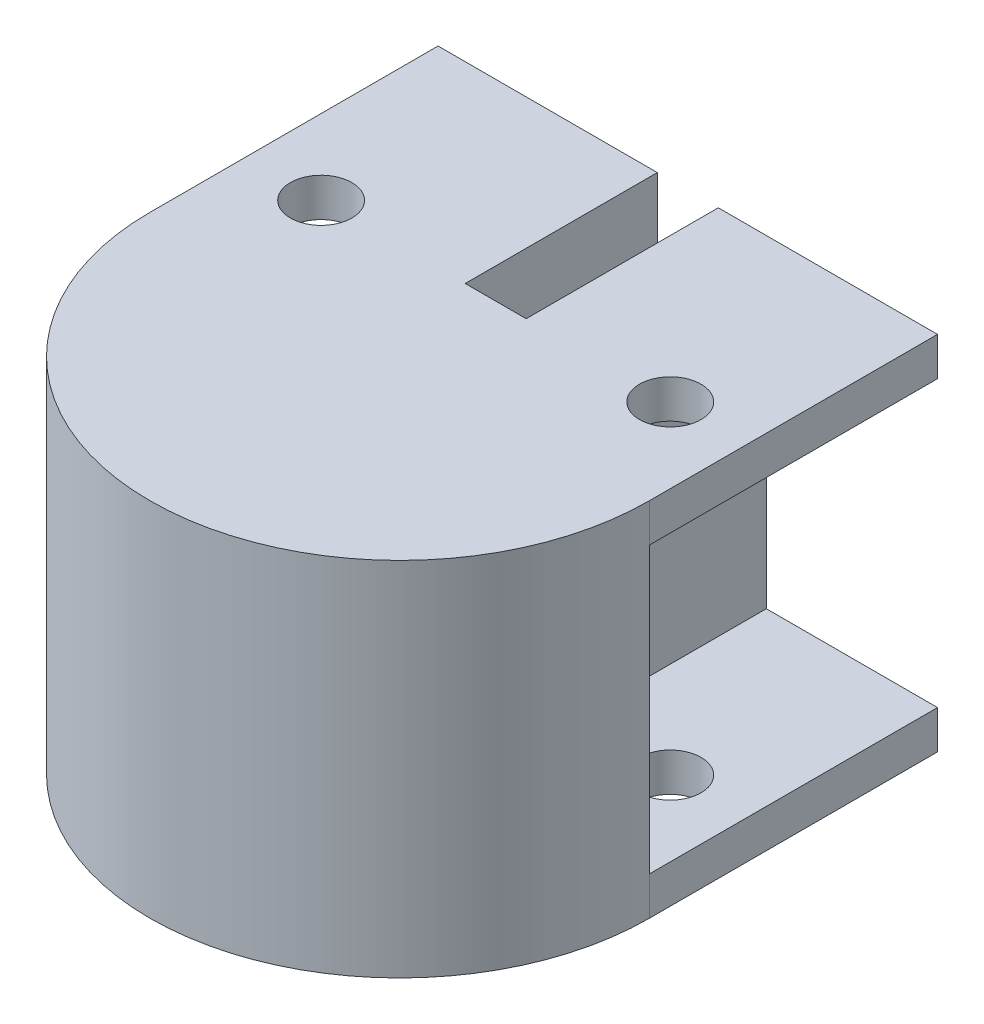
ISO-10303-21;
HEADER;
FILE_DESCRIPTION(('STEP AP214'),'2;1');
FILE_NAME('part.step','',(''),(''),'','','');
FILE_SCHEMA(('AUTOMOTIVE_DESIGN { 1 0 10303 214 1 1 1 1 }'));
ENDSEC;
DATA;
#1=APPLICATION_CONTEXT('core data for automotive mechanical design processes');
#2=APPLICATION_PROTOCOL_DEFINITION('international standard','automotive_design',2000,#1);
#3=PRODUCT_CONTEXT('',#1,'mechanical');
#4=PRODUCT('Part','Part','',(#3));
#5=PRODUCT_RELATED_PRODUCT_CATEGORY('part','',(#4));
#6=PRODUCT_DEFINITION_FORMATION('','',#4);
#7=PRODUCT_DEFINITION_CONTEXT('part definition',#1,'design');
#8=PRODUCT_DEFINITION('design','',#6,#7);
#9=PRODUCT_DEFINITION_SHAPE('','',#8);
#10=(LENGTH_UNIT() NAMED_UNIT(*) SI_UNIT(.MILLI.,.METRE.));
#11=(NAMED_UNIT(*) PLANE_ANGLE_UNIT() SI_UNIT($,.RADIAN.));
#12=(NAMED_UNIT(*) SI_UNIT($,.STERADIAN.) SOLID_ANGLE_UNIT());
#13=UNCERTAINTY_MEASURE_WITH_UNIT(LENGTH_MEASURE(1.E-05),#10,'distance_accuracy_value','');
#14=(GEOMETRIC_REPRESENTATION_CONTEXT(3) GLOBAL_UNCERTAINTY_ASSIGNED_CONTEXT((#13)) GLOBAL_UNIT_ASSIGNED_CONTEXT((#10,
#11,#12)) REPRESENTATION_CONTEXT('',''));
#15=CARTESIAN_POINT('',(0.,0.,0.));
#16=DIRECTION('',(0.,0.,1.));
#17=DIRECTION('',(1.,0.,0.));
#18=AXIS2_PLACEMENT_3D('',#15,#16,#17);
#19=CARTESIAN_POINT('',(0.,0.,5.));
#20=DIRECTION('',(0.,1.,0.));
#21=DIRECTION('',(0.,0.,1.));
#22=AXIS2_PLACEMENT_3D('',#19,#20,#21);
#23=PLANE('',#22);
#24=CARTESIAN_POINT('',(-9.0875,0.,0.));
#25=DIRECTION('',(0.,1.,0.));
#26=DIRECTION('',(0.,0.,-1.));
#27=AXIS2_PLACEMENT_3D('',#24,#25,#26);
#28=CIRCLE('',#27,1.6);
#29=CARTESIAN_POINT('',(-9.0875,0.,-1.6));
#30=VERTEX_POINT('',#29);
#31=EDGE_CURVE('E249',#30,#30,#28,.T.);
#32=ORIENTED_EDGE('',*,*,#31,.T.);
#33=EDGE_LOOP('',(#32));
#34=FACE_BOUND('',#33,.T.);
#35=DIRECTION('',(0.,0.,-1.));
#36=VECTOR('',#35,1.);
#37=CARTESIAN_POINT('',(-4.0875,0.,-10.));
#38=LINE('',#37,#36);
#39=CARTESIAN_POINT('',(-4.0875,0.,5.));
#40=VERTEX_POINT('',#39);
#41=CARTESIAN_POINT('',(-4.0875,0.,-10.));
#42=VERTEX_POINT('',#41);
#43=EDGE_CURVE('E48',#40,#42,#38,.T.);
#44=ORIENTED_EDGE('',*,*,#43,.F.);
#45=DIRECTION('',(1.,0.,0.));
#46=VECTOR('',#45,1.);
#47=CARTESIAN_POINT('',(-4.0875,0.,5.));
#48=LINE('',#47,#46);
#49=CARTESIAN_POINT('',(-13.,0.,5.));
#50=VERTEX_POINT('',#49);
#51=EDGE_CURVE('E229',#50,#40,#48,.T.);
#52=ORIENTED_EDGE('',*,*,#51,.F.);
#53=DIRECTION('',(0.,0.,1.));
#54=VECTOR('',#53,1.);
#55=CARTESIAN_POINT('',(-13.,0.,-10.));
#56=LINE('',#55,#54);
#57=CARTESIAN_POINT('',(-13.,0.,-10.));
#58=VERTEX_POINT('',#57);
#59=EDGE_CURVE('E278',#58,#50,#56,.T.);
#60=ORIENTED_EDGE('',*,*,#59,.F.);
#61=DIRECTION('',(-1.,0.,0.));
#62=VECTOR('',#61,1.);
#63=CARTESIAN_POINT('',(-1.5875,0.,-10.));
#64=LINE('',#63,#62);
#65=EDGE_CURVE('E259',#42,#58,#64,.T.);
#66=ORIENTED_EDGE('',*,*,#65,.F.);
#67=EDGE_LOOP('',(#44,#52,#60,#66));
#68=FACE_BOUND('',#67,.T.);
#69=ADVANCED_FACE('F33',(#34,#68),#23,.F.);
#70=CARTESIAN_POINT('',(9.0875,0.,0.));
#71=DIRECTION('',(0.,1.,0.));
#72=DIRECTION('',(0.,0.,1.));
#73=AXIS2_PLACEMENT_3D('',#70,#71,#72);
#74=CIRCLE('',#73,1.6);
#75=CARTESIAN_POINT('',(9.0875,0.,1.6));
#76=VERTEX_POINT('',#75);
#77=EDGE_CURVE('E253',#76,#76,#74,.T.);
#78=ORIENTED_EDGE('',*,*,#77,.T.);
#79=EDGE_LOOP('',(#78));
#80=FACE_BOUND('',#79,.T.);
#81=DIRECTION('',(0.,0.,1.));
#82=VECTOR('',#81,1.);
#83=CARTESIAN_POINT('',(4.0875,0.,-10.));
#84=LINE('',#83,#82);
#85=CARTESIAN_POINT('',(4.0875,0.,-10.));
#86=VERTEX_POINT('',#85);
#87=CARTESIAN_POINT('',(4.0875,0.,5.));
#88=VERTEX_POINT('',#87);
#89=EDGE_CURVE('E225',#86,#88,#84,.T.);
#90=ORIENTED_EDGE('',*,*,#89,.F.);
#91=DIRECTION('',(-1.,0.,0.));
#92=VECTOR('',#91,1.);
#93=CARTESIAN_POINT('',(1.5875,0.,-10.));
#94=LINE('',#93,#92);
#95=CARTESIAN_POINT('',(13.,0.,-10.));
#96=VERTEX_POINT('',#95);
#97=EDGE_CURVE('E264',#96,#86,#94,.T.);
#98=ORIENTED_EDGE('',*,*,#97,.F.);
#99=DIRECTION('',(0.,0.,-1.));
#100=VECTOR('',#99,1.);
#101=CARTESIAN_POINT('',(13.,0.,-10.));
#102=LINE('',#101,#100);
#103=CARTESIAN_POINT('',(13.,0.,5.));
#104=VERTEX_POINT('',#103);
#105=EDGE_CURVE('E281',#104,#96,#102,.T.);
#106=ORIENTED_EDGE('',*,*,#105,.F.);
#107=DIRECTION('',(1.,0.,0.));
#108=VECTOR('',#107,1.);
#109=CARTESIAN_POINT('',(4.0875,0.,5.));
#110=LINE('',#109,#108);
#111=EDGE_CURVE('E56',#88,#104,#110,.T.);
#112=ORIENTED_EDGE('',*,*,#111,.F.);
#113=EDGE_LOOP('',(#90,#98,#106,#112));
#114=FACE_BOUND('',#113,.T.);
#115=ADVANCED_FACE('F312',(#80,#114),#23,.F.);
#116=CARTESIAN_POINT('',(0.,2.,5.));
#117=DIRECTION('',(0.,1.,0.));
#118=DIRECTION('',(0.,0.,1.));
#119=AXIS2_PLACEMENT_3D('',#116,#117,#118);
#120=PLANE('',#119);
#121=CARTESIAN_POINT('',(9.0875,2.,0.));
#122=DIRECTION('',(0.,1.,0.));
#123=DIRECTION('',(0.,0.,1.));
#124=AXIS2_PLACEMENT_3D('',#121,#122,#123);
#125=CIRCLE('',#124,1.6);
#126=CARTESIAN_POINT('',(9.0875,2.,1.6));
#127=VERTEX_POINT('',#126);
#128=EDGE_CURVE('E256',#127,#127,#125,.T.);
#129=ORIENTED_EDGE('',*,*,#128,.F.);
#130=EDGE_LOOP('',(#129));
#131=FACE_BOUND('',#130,.T.);
#132=DIRECTION('',(0.,0.,1.));
#133=VECTOR('',#132,1.);
#134=CARTESIAN_POINT('',(1.5875,2.,0.));
#135=LINE('',#134,#133);
#136=CARTESIAN_POINT('',(1.5875,2.,-10.));
#137=VERTEX_POINT('',#136);
#138=CARTESIAN_POINT('',(1.5875,2.,0.));
#139=VERTEX_POINT('',#138);
#140=EDGE_CURVE('E152',#137,#139,#135,.T.);
#141=ORIENTED_EDGE('',*,*,#140,.T.);
#142=DIRECTION('',(-1.,0.,0.));
#143=VECTOR('',#142,1.);
#144=CARTESIAN_POINT('',(-1.5875,2.,0.));
#145=LINE('',#144,#143);
#146=CARTESIAN_POINT('',(-1.5875,2.,0.));
#147=VERTEX_POINT('',#146);
#148=EDGE_CURVE('E263',#139,#147,#145,.T.);
#149=ORIENTED_EDGE('',*,*,#148,.T.);
#150=DIRECTION('',(0.,0.,-1.));
#151=VECTOR('',#150,1.);
#152=CARTESIAN_POINT('',(-1.5875,2.,0.));
#153=LINE('',#152,#151);
#154=CARTESIAN_POINT('',(-1.5875,2.,-10.));
#155=VERTEX_POINT('',#154);
#156=EDGE_CURVE('E266',#147,#155,#153,.T.);
#157=ORIENTED_EDGE('',*,*,#156,.T.);
#158=DIRECTION('',(-1.,0.,0.));
#159=VECTOR('',#158,1.);
#160=CARTESIAN_POINT('',(-1.5875,2.,-10.));
#161=LINE('',#160,#159);
#162=CARTESIAN_POINT('',(-13.,2.,-10.));
#163=VERTEX_POINT('',#162);
#164=EDGE_CURVE('E268',#155,#163,#161,.T.);
#165=ORIENTED_EDGE('',*,*,#164,.T.);
#166=DIRECTION('',(0.,0.,1.));
#167=VECTOR('',#166,1.);
#168=CARTESIAN_POINT('',(-13.,2.,-10.));
#169=LINE('',#168,#167);
#170=CARTESIAN_POINT('',(-13.,2.,5.));
#171=VERTEX_POINT('',#170);
#172=EDGE_CURVE('E270',#163,#171,#169,.T.);
#173=ORIENTED_EDGE('',*,*,#172,.T.);
#174=CARTESIAN_POINT('',(0.,2.,5.));
#175=DIRECTION('',(0.,1.,0.));
#176=DIRECTION('',(0.,0.,1.));
#177=AXIS2_PLACEMENT_3D('',#174,#175,#176);
#178=CIRCLE('',#177,13.);
#179=CARTESIAN_POINT('',(13.,2.,5.));
#180=VERTEX_POINT('',#179);
#181=EDGE_CURVE('E272',#171,#180,#178,.T.);
#182=ORIENTED_EDGE('',*,*,#181,.T.);
#183=DIRECTION('',(0.,0.,-1.));
#184=VECTOR('',#183,1.);
#185=CARTESIAN_POINT('',(13.,2.,-10.));
#186=LINE('',#185,#184);
#187=CARTESIAN_POINT('',(13.,2.,-10.));
#188=VERTEX_POINT('',#187);
#189=EDGE_CURVE('E274',#180,#188,#186,.T.);
#190=ORIENTED_EDGE('',*,*,#189,.T.);
#191=DIRECTION('',(-1.,0.,0.));
#192=VECTOR('',#191,1.);
#193=CARTESIAN_POINT('',(1.5875,2.,-10.));
#194=LINE('',#193,#192);
#195=EDGE_CURVE('E157',#188,#137,#194,.T.);
#196=ORIENTED_EDGE('',*,*,#195,.T.);
#197=EDGE_LOOP('',(#141,#149,#157,#165,#173,#182,#190,#196));
#198=FACE_BOUND('',#197,.T.);
#199=CARTESIAN_POINT('',(-9.0875,2.,0.));
#200=DIRECTION('',(0.,1.,0.));
#201=DIRECTION('',(0.,0.,-1.));
#202=AXIS2_PLACEMENT_3D('',#199,#200,#201);
#203=CIRCLE('',#202,1.6);
#204=CARTESIAN_POINT('',(-9.0875,2.,-1.6));
#205=VERTEX_POINT('',#204);
#206=EDGE_CURVE('E250',#205,#205,#203,.T.);
#207=ORIENTED_EDGE('',*,*,#206,.F.);
#208=EDGE_LOOP('',(#207));
#209=FACE_BOUND('',#208,.T.);
#210=ADVANCED_FACE('F306',(#131,#198,#209),#120,.T.);
#211=CARTESIAN_POINT('',(1.5875,2.,0.));
#212=DIRECTION('',(1.,0.,0.));
#213=DIRECTION('',(0.,0.,-1.));
#214=AXIS2_PLACEMENT_3D('',#211,#212,#213);
#215=PLANE('',#214);
#216=DIRECTION('',(0.,-1.,0.));
#217=VECTOR('',#216,1.);
#218=CARTESIAN_POINT('',(1.5875,2.,-10.));
#219=LINE('',#218,#217);
#220=CARTESIAN_POINT('',(1.5875,-16.825,-10.));
#221=VERTEX_POINT('',#220);
#222=EDGE_CURVE('E146',#137,#221,#219,.T.);
#223=ORIENTED_EDGE('',*,*,#222,.T.);
#224=DIRECTION('',(0.,0.,1.));
#225=VECTOR('',#224,1.);
#226=CARTESIAN_POINT('',(1.5875,-16.825,0.));
#227=LINE('',#226,#225);
#228=CARTESIAN_POINT('',(1.5875,-16.825,0.));
#229=VERTEX_POINT('',#228);
#230=EDGE_CURVE('E149',#221,#229,#227,.T.);
#231=ORIENTED_EDGE('',*,*,#230,.T.);
#232=DIRECTION('',(0.,-1.,0.));
#233=VECTOR('',#232,1.);
#234=CARTESIAN_POINT('',(1.5875,2.,0.));
#235=LINE('',#234,#233);
#236=EDGE_CURVE('E11',#139,#229,#235,.T.);
#237=ORIENTED_EDGE('',*,*,#236,.F.);
#238=ORIENTED_EDGE('',*,*,#140,.F.);
#239=EDGE_LOOP('',(#223,#231,#237,#238));
#240=FACE_BOUND('',#239,.T.);
#241=ADVANCED_FACE('F35',(#240),#215,.F.);
#242=CARTESIAN_POINT('',(-1.5875,2.,0.));
#243=DIRECTION('',(0.,0.,1.));
#244=DIRECTION('',(1.,0.,0.));
#245=AXIS2_PLACEMENT_3D('',#242,#243,#244);
#246=PLANE('',#245);
#247=ORIENTED_EDGE('',*,*,#236,.T.);
#248=DIRECTION('',(-1.,0.,0.));
#249=VECTOR('',#248,1.);
#250=CARTESIAN_POINT('',(-1.5875,-16.825,0.));
#251=LINE('',#250,#249);
#252=CARTESIAN_POINT('',(-1.5875,-16.825,0.));
#253=VERTEX_POINT('',#252);
#254=EDGE_CURVE('E167',#229,#253,#251,.T.);
#255=ORIENTED_EDGE('',*,*,#254,.T.);
#256=DIRECTION('',(0.,-1.,0.));
#257=VECTOR('',#256,1.);
#258=CARTESIAN_POINT('',(-1.5875,2.,0.));
#259=LINE('',#258,#257);
#260=EDGE_CURVE('E41',#147,#253,#259,.T.);
#261=ORIENTED_EDGE('',*,*,#260,.F.);
#262=ORIENTED_EDGE('',*,*,#148,.F.);
#263=EDGE_LOOP('',(#247,#255,#261,#262));
#264=FACE_BOUND('',#263,.T.);
#265=ADVANCED_FACE('F304',(#264),#246,.F.);
#266=CARTESIAN_POINT('',(-1.5875,2.,0.));
#267=DIRECTION('',(-1.,0.,0.));
#268=DIRECTION('',(0.,0.,1.));
#269=AXIS2_PLACEMENT_3D('',#266,#267,#268);
#270=PLANE('',#269);
#271=ORIENTED_EDGE('',*,*,#260,.T.);
#272=DIRECTION('',(0.,0.,-1.));
#273=VECTOR('',#272,1.);
#274=CARTESIAN_POINT('',(-1.5875,-16.825,0.));
#275=LINE('',#274,#273);
#276=CARTESIAN_POINT('',(-1.5875,-16.825,-10.));
#277=VERTEX_POINT('',#276);
#278=EDGE_CURVE('E188',#253,#277,#275,.T.);
#279=ORIENTED_EDGE('',*,*,#278,.T.);
#280=DIRECTION('',(0.,-1.,0.));
#281=VECTOR('',#280,1.);
#282=CARTESIAN_POINT('',(-1.5875,2.,-10.));
#283=LINE('',#282,#281);
#284=EDGE_CURVE('E295',#155,#277,#283,.T.);
#285=ORIENTED_EDGE('',*,*,#284,.F.);
#286=ORIENTED_EDGE('',*,*,#156,.F.);
#287=EDGE_LOOP('',(#271,#279,#285,#286));
#288=FACE_BOUND('',#287,.T.);
#289=ADVANCED_FACE('F299',(#288),#270,.F.);
#290=CARTESIAN_POINT('',(-1.5875,2.,-10.));
#291=DIRECTION('',(0.,0.,1.));
#292=DIRECTION('',(1.,0.,0.));
#293=AXIS2_PLACEMENT_3D('',#290,#291,#292);
#294=PLANE('',#293);
#295=ORIENTED_EDGE('',*,*,#284,.T.);
#296=DIRECTION('',(-1.,0.,0.));
#297=VECTOR('',#296,1.);
#298=CARTESIAN_POINT('',(-1.5875,-16.825,-10.));
#299=LINE('',#298,#297);
#300=CARTESIAN_POINT('',(-13.,-16.825,-10.));
#301=VERTEX_POINT('',#300);
#302=EDGE_CURVE('E185',#277,#301,#299,.T.);
#303=ORIENTED_EDGE('',*,*,#302,.T.);
#304=DIRECTION('',(0.,1.,0.));
#305=VECTOR('',#304,1.);
#306=CARTESIAN_POINT('',(-13.,-16.825,-10.));
#307=LINE('',#306,#305);
#308=CARTESIAN_POINT('',(-13.,-14.825,-10.));
#309=VERTEX_POINT('',#308);
#310=EDGE_CURVE('E192',#301,#309,#307,.T.);
#311=ORIENTED_EDGE('',*,*,#310,.T.);
#312=DIRECTION('',(-1.,0.,0.));
#313=VECTOR('',#312,1.);
#314=CARTESIAN_POINT('',(-1.5875,-14.825,-10.));
#315=LINE('',#314,#313);
#316=CARTESIAN_POINT('',(-4.0875,-14.825,-10.));
#317=VERTEX_POINT('',#316);
#318=EDGE_CURVE('E168',#317,#309,#315,.T.);
#319=ORIENTED_EDGE('',*,*,#318,.F.);
#320=DIRECTION('',(0.,1.,0.));
#321=VECTOR('',#320,1.);
#322=CARTESIAN_POINT('',(-4.0875,-7.4125,-10.));
#323=LINE('',#322,#321);
#324=EDGE_CURVE('E235',#317,#42,#323,.T.);
#325=ORIENTED_EDGE('',*,*,#324,.T.);
#326=ORIENTED_EDGE('',*,*,#65,.T.);
#327=DIRECTION('',(0.,-1.,0.));
#328=VECTOR('',#327,1.);
#329=CARTESIAN_POINT('',(-13.,2.,-10.));
#330=LINE('',#329,#328);
#331=EDGE_CURVE('E292',#163,#58,#330,.T.);
#332=ORIENTED_EDGE('',*,*,#331,.F.);
#333=ORIENTED_EDGE('',*,*,#164,.F.);
#334=EDGE_LOOP('',(#295,#303,#311,#319,#325,#326,#332,#333));
#335=FACE_BOUND('',#334,.T.);
#336=ADVANCED_FACE('F334',(#335),#294,.F.);
#337=CARTESIAN_POINT('',(-13.,2.,-10.));
#338=DIRECTION('',(1.,0.,0.));
#339=DIRECTION('',(0.,0.,-1.));
#340=AXIS2_PLACEMENT_3D('',#337,#338,#339);
#341=PLANE('',#340);
#342=ORIENTED_EDGE('',*,*,#59,.T.);
#343=DIRECTION('',(0.,-1.,0.));
#344=VECTOR('',#343,1.);
#345=CARTESIAN_POINT('',(-13.,2.,5.));
#346=LINE('',#345,#344);
#347=EDGE_CURVE('E289',#171,#50,#346,.T.);
#348=ORIENTED_EDGE('',*,*,#347,.F.);
#349=ORIENTED_EDGE('',*,*,#172,.F.);
#350=ORIENTED_EDGE('',*,*,#331,.T.);
#351=EDGE_LOOP('',(#342,#348,#349,#350));
#352=FACE_BOUND('',#351,.T.);
#353=ADVANCED_FACE('F342',(#352),#341,.F.);
#354=CARTESIAN_POINT('',(0.,2.,5.));
#355=DIRECTION('',(0.,-1.,0.));
#356=DIRECTION('',(0.,0.,-1.));
#357=AXIS2_PLACEMENT_3D('',#354,#355,#356);
#358=CYLINDRICAL_SURFACE('',#357,13.);
#359=ORIENTED_EDGE('',*,*,#347,.T.);
#360=DIRECTION('',(0.,1.,0.));
#361=VECTOR('',#360,1.);
#362=CARTESIAN_POINT('',(-13.,-7.4125,5.));
#363=LINE('',#362,#361);
#364=CARTESIAN_POINT('',(-13.,-14.825,5.));
#365=VERTEX_POINT('',#364);
#366=EDGE_CURVE('E241',#365,#50,#363,.T.);
#367=ORIENTED_EDGE('',*,*,#366,.F.);
#368=DIRECTION('',(0.,1.,0.));
#369=VECTOR('',#368,1.);
#370=CARTESIAN_POINT('',(-13.,-16.825,5.));
#371=LINE('',#370,#369);
#372=CARTESIAN_POINT('',(-13.,-16.825,5.));
#373=VERTEX_POINT('',#372);
#374=EDGE_CURVE('E206',#373,#365,#371,.T.);
#375=ORIENTED_EDGE('',*,*,#374,.F.);
#376=CARTESIAN_POINT('',(0.,-16.825,5.));
#377=DIRECTION('',(0.,1.,0.));
#378=DIRECTION('',(0.,0.,1.));
#379=AXIS2_PLACEMENT_3D('',#376,#377,#378);
#380=CIRCLE('',#379,13.);
#381=CARTESIAN_POINT('',(13.,-16.825,5.));
#382=VERTEX_POINT('',#381);
#383=EDGE_CURVE('E176',#373,#382,#380,.T.);
#384=ORIENTED_EDGE('',*,*,#383,.T.);
#385=DIRECTION('',(0.,1.,0.));
#386=VECTOR('',#385,1.);
#387=CARTESIAN_POINT('',(13.,-16.825,5.));
#388=LINE('',#387,#386);
#389=CARTESIAN_POINT('',(13.,-14.825,5.));
#390=VERTEX_POINT('',#389);
#391=EDGE_CURVE('E209',#382,#390,#388,.T.);
#392=ORIENTED_EDGE('',*,*,#391,.T.);
#393=DIRECTION('',(0.,1.,0.));
#394=VECTOR('',#393,1.);
#395=CARTESIAN_POINT('',(13.,-7.4125,5.));
#396=LINE('',#395,#394);
#397=EDGE_CURVE('E244',#390,#104,#396,.T.);
#398=ORIENTED_EDGE('',*,*,#397,.T.);
#399=DIRECTION('',(0.,-1.,0.));
#400=VECTOR('',#399,1.);
#401=CARTESIAN_POINT('',(13.,2.,5.));
#402=LINE('',#401,#400);
#403=EDGE_CURVE('E286',#180,#104,#402,.T.);
#404=ORIENTED_EDGE('',*,*,#403,.F.);
#405=ORIENTED_EDGE('',*,*,#181,.F.);
#406=EDGE_LOOP('',(#359,#367,#375,#384,#392,#398,#404,#405));
#407=FACE_BOUND('',#406,.T.);
#408=ADVANCED_FACE('F324',(#407),#358,.T.);
#409=CARTESIAN_POINT('',(13.,2.,-10.));
#410=DIRECTION('',(-1.,0.,0.));
#411=DIRECTION('',(0.,0.,1.));
#412=AXIS2_PLACEMENT_3D('',#409,#410,#411);
#413=PLANE('',#412);
#414=ORIENTED_EDGE('',*,*,#105,.T.);
#415=DIRECTION('',(0.,-1.,0.));
#416=VECTOR('',#415,1.);
#417=CARTESIAN_POINT('',(13.,2.,-10.));
#418=LINE('',#417,#416);
#419=EDGE_CURVE('E156',#188,#96,#418,.T.);
#420=ORIENTED_EDGE('',*,*,#419,.F.);
#421=ORIENTED_EDGE('',*,*,#189,.F.);
#422=ORIENTED_EDGE('',*,*,#403,.T.);
#423=EDGE_LOOP('',(#414,#420,#421,#422));
#424=FACE_BOUND('',#423,.T.);
#425=ADVANCED_FACE('F344',(#424),#413,.F.);
#426=CARTESIAN_POINT('',(1.5875,2.,-10.));
#427=DIRECTION('',(0.,0.,1.));
#428=DIRECTION('',(1.,0.,0.));
#429=AXIS2_PLACEMENT_3D('',#426,#427,#428);
#430=PLANE('',#429);
#431=ORIENTED_EDGE('',*,*,#97,.T.);
#432=DIRECTION('',(0.,1.,0.));
#433=VECTOR('',#432,1.);
#434=CARTESIAN_POINT('',(4.0875,-7.4125,-10.));
#435=LINE('',#434,#433);
#436=CARTESIAN_POINT('',(4.0875,-14.825,-10.));
#437=VERTEX_POINT('',#436);
#438=EDGE_CURVE('E232',#437,#86,#435,.T.);
#439=ORIENTED_EDGE('',*,*,#438,.F.);
#440=DIRECTION('',(-1.,0.,0.));
#441=VECTOR('',#440,1.);
#442=CARTESIAN_POINT('',(1.5875,-14.825,-10.));
#443=LINE('',#442,#441);
#444=CARTESIAN_POINT('',(13.,-14.825,-10.));
#445=VERTEX_POINT('',#444);
#446=EDGE_CURVE('E193',#445,#437,#443,.T.);
#447=ORIENTED_EDGE('',*,*,#446,.F.);
#448=DIRECTION('',(0.,1.,0.));
#449=VECTOR('',#448,1.);
#450=CARTESIAN_POINT('',(13.,-16.825,-10.));
#451=LINE('',#450,#449);
#452=CARTESIAN_POINT('',(13.,-16.825,-10.));
#453=VERTEX_POINT('',#452);
#454=EDGE_CURVE('E173',#453,#445,#451,.T.);
#455=ORIENTED_EDGE('',*,*,#454,.F.);
#456=DIRECTION('',(-1.,0.,0.));
#457=VECTOR('',#456,1.);
#458=CARTESIAN_POINT('',(1.5875,-16.825,-10.));
#459=LINE('',#458,#457);
#460=EDGE_CURVE('E163',#453,#221,#459,.T.);
#461=ORIENTED_EDGE('',*,*,#460,.T.);
#462=ORIENTED_EDGE('',*,*,#222,.F.);
#463=ORIENTED_EDGE('',*,*,#195,.F.);
#464=ORIENTED_EDGE('',*,*,#419,.T.);
#465=EDGE_LOOP('',(#431,#439,#447,#455,#461,#462,#463,#464));
#466=FACE_BOUND('',#465,.T.);
#467=ADVANCED_FACE('F171',(#466),#430,.F.);
#468=CARTESIAN_POINT('',(9.0875,2.,0.));
#469=DIRECTION('',(0.,-1.,0.));
#470=DIRECTION('',(0.,0.,-1.));
#471=AXIS2_PLACEMENT_3D('',#468,#469,#470);
#472=CYLINDRICAL_SURFACE('',#471,1.6);
#473=ORIENTED_EDGE('',*,*,#128,.T.);
#474=EDGE_LOOP('',(#473));
#475=FACE_BOUND('',#474,.T.);
#476=ORIENTED_EDGE('',*,*,#77,.F.);
#477=EDGE_LOOP('',(#476));
#478=FACE_BOUND('',#477,.T.);
#479=ADVANCED_FACE('F351',(#475,#478),#472,.F.);
#480=CARTESIAN_POINT('',(-9.0875,2.,0.));
#481=DIRECTION('',(0.,-1.,0.));
#482=DIRECTION('',(0.,0.,-1.));
#483=AXIS2_PLACEMENT_3D('',#480,#481,#482);
#484=CYLINDRICAL_SURFACE('',#483,1.6);
#485=ORIENTED_EDGE('',*,*,#206,.T.);
#486=EDGE_LOOP('',(#485));
#487=FACE_BOUND('',#486,.T.);
#488=ORIENTED_EDGE('',*,*,#31,.F.);
#489=EDGE_LOOP('',(#488));
#490=FACE_BOUND('',#489,.T.);
#491=ADVANCED_FACE('F367',(#487,#490),#484,.F.);
#492=CARTESIAN_POINT('',(4.0875,-7.4125,-10.));
#493=DIRECTION('',(-1.,0.,0.));
#494=DIRECTION('',(0.,0.,1.));
#495=AXIS2_PLACEMENT_3D('',#492,#493,#494);
#496=PLANE('',#495);
#497=ORIENTED_EDGE('',*,*,#89,.T.);
#498=DIRECTION('',(0.,1.,0.));
#499=VECTOR('',#498,1.);
#500=CARTESIAN_POINT('',(4.0875,-7.4125,5.));
#501=LINE('',#500,#499);
#502=CARTESIAN_POINT('',(4.0875,-14.825,5.));
#503=VERTEX_POINT('',#502);
#504=EDGE_CURVE('E247',#503,#88,#501,.T.);
#505=ORIENTED_EDGE('',*,*,#504,.F.);
#506=DIRECTION('',(0.,0.,1.));
#507=VECTOR('',#506,1.);
#508=CARTESIAN_POINT('',(4.0875,-14.825,-10.));
#509=LINE('',#508,#507);
#510=EDGE_CURVE('E213',#437,#503,#509,.T.);
#511=ORIENTED_EDGE('',*,*,#510,.F.);
#512=ORIENTED_EDGE('',*,*,#438,.T.);
#513=EDGE_LOOP('',(#497,#505,#511,#512));
#514=FACE_BOUND('',#513,.T.);
#515=ADVANCED_FACE('F314',(#514),#496,.F.);
#516=CARTESIAN_POINT('',(4.0875,-7.4125,5.));
#517=DIRECTION('',(0.,0.,1.));
#518=DIRECTION('',(1.,0.,0.));
#519=AXIS2_PLACEMENT_3D('',#516,#517,#518);
#520=PLANE('',#519);
#521=ORIENTED_EDGE('',*,*,#111,.T.);
#522=ORIENTED_EDGE('',*,*,#397,.F.);
#523=DIRECTION('',(1.,0.,0.));
#524=VECTOR('',#523,1.);
#525=CARTESIAN_POINT('',(4.0875,-14.825,5.));
#526=LINE('',#525,#524);
#527=EDGE_CURVE('E222',#503,#390,#526,.T.);
#528=ORIENTED_EDGE('',*,*,#527,.F.);
#529=ORIENTED_EDGE('',*,*,#504,.T.);
#530=EDGE_LOOP('',(#521,#522,#528,#529));
#531=FACE_BOUND('',#530,.T.);
#532=ADVANCED_FACE('F374',(#531),#520,.F.);
#533=CARTESIAN_POINT('',(-4.0875,-7.4125,5.));
#534=DIRECTION('',(0.,0.,1.));
#535=DIRECTION('',(1.,0.,0.));
#536=AXIS2_PLACEMENT_3D('',#533,#534,#535);
#537=PLANE('',#536);
#538=ORIENTED_EDGE('',*,*,#51,.T.);
#539=DIRECTION('',(0.,1.,0.));
#540=VECTOR('',#539,1.);
#541=CARTESIAN_POINT('',(-4.0875,-7.4125,5.));
#542=LINE('',#541,#540);
#543=CARTESIAN_POINT('',(-4.0875,-14.825,5.));
#544=VERTEX_POINT('',#543);
#545=EDGE_CURVE('E238',#544,#40,#542,.T.);
#546=ORIENTED_EDGE('',*,*,#545,.F.);
#547=DIRECTION('',(1.,0.,0.));
#548=VECTOR('',#547,1.);
#549=CARTESIAN_POINT('',(-4.0875,-14.825,5.));
#550=LINE('',#549,#548);
#551=EDGE_CURVE('E219',#365,#544,#550,.T.);
#552=ORIENTED_EDGE('',*,*,#551,.F.);
#553=ORIENTED_EDGE('',*,*,#366,.T.);
#554=EDGE_LOOP('',(#538,#546,#552,#553));
#555=FACE_BOUND('',#554,.T.);
#556=ADVANCED_FACE('F377',(#555),#537,.F.);
#557=CARTESIAN_POINT('',(-4.0875,-7.4125,-10.));
#558=DIRECTION('',(1.,0.,0.));
#559=DIRECTION('',(0.,0.,-1.));
#560=AXIS2_PLACEMENT_3D('',#557,#558,#559);
#561=PLANE('',#560);
#562=ORIENTED_EDGE('',*,*,#43,.T.);
#563=ORIENTED_EDGE('',*,*,#324,.F.);
#564=DIRECTION('',(0.,0.,-1.));
#565=VECTOR('',#564,1.);
#566=CARTESIAN_POINT('',(-4.0875,-14.825,-10.));
#567=LINE('',#566,#565);
#568=EDGE_CURVE('E216',#544,#317,#567,.T.);
#569=ORIENTED_EDGE('',*,*,#568,.F.);
#570=ORIENTED_EDGE('',*,*,#545,.T.);
#571=EDGE_LOOP('',(#562,#563,#569,#570));
#572=FACE_BOUND('',#571,.T.);
#573=ADVANCED_FACE('F381',(#572),#561,.F.);
#574=CARTESIAN_POINT('',(0.,-14.825,5.));
#575=DIRECTION('',(0.,-1.,0.));
#576=DIRECTION('',(0.,0.,1.));
#577=AXIS2_PLACEMENT_3D('',#574,#575,#576);
#578=PLANE('',#577);
#579=CARTESIAN_POINT('',(9.0875,-14.825,0.));
#580=DIRECTION('',(0.,1.,0.));
#581=DIRECTION('',(0.,0.,1.));
#582=AXIS2_PLACEMENT_3D('',#579,#580,#581);
#583=CIRCLE('',#582,1.6);
#584=CARTESIAN_POINT('',(9.0875,-14.825,1.6));
#585=VERTEX_POINT('',#584);
#586=EDGE_CURVE('E414',#585,#585,#583,.T.);
#587=ORIENTED_EDGE('',*,*,#586,.F.);
#588=EDGE_LOOP('',(#587));
#589=FACE_BOUND('',#588,.T.);
#590=ORIENTED_EDGE('',*,*,#446,.T.);
#591=ORIENTED_EDGE('',*,*,#510,.T.);
#592=ORIENTED_EDGE('',*,*,#527,.T.);
#593=DIRECTION('',(0.,0.,-1.));
#594=VECTOR('',#593,1.);
#595=CARTESIAN_POINT('',(13.,-14.825,-10.));
#596=LINE('',#595,#594);
#597=EDGE_CURVE('E196',#390,#445,#596,.T.);
#598=ORIENTED_EDGE('',*,*,#597,.T.);
#599=EDGE_LOOP('',(#590,#591,#592,#598));
#600=FACE_BOUND('',#599,.T.);
#601=ADVANCED_FACE('F319',(#589,#600),#578,.F.);
#602=CARTESIAN_POINT('',(-9.0875,-14.825,0.));
#603=DIRECTION('',(0.,1.,0.));
#604=DIRECTION('',(0.,0.,-1.));
#605=AXIS2_PLACEMENT_3D('',#602,#603,#604);
#606=CIRCLE('',#605,1.6);
#607=CARTESIAN_POINT('',(-9.0875,-14.825,-1.6));
#608=VERTEX_POINT('',#607);
#609=EDGE_CURVE('E411',#608,#608,#606,.T.);
#610=ORIENTED_EDGE('',*,*,#609,.F.);
#611=EDGE_LOOP('',(#610));
#612=FACE_BOUND('',#611,.T.);
#613=DIRECTION('',(0.,0.,1.));
#614=VECTOR('',#613,1.);
#615=CARTESIAN_POINT('',(-13.,-14.825,-10.));
#616=LINE('',#615,#614);
#617=EDGE_CURVE('E200',#309,#365,#616,.T.);
#618=ORIENTED_EDGE('',*,*,#617,.T.);
#619=ORIENTED_EDGE('',*,*,#551,.T.);
#620=ORIENTED_EDGE('',*,*,#568,.T.);
#621=ORIENTED_EDGE('',*,*,#318,.T.);
#622=EDGE_LOOP('',(#618,#619,#620,#621));
#623=FACE_BOUND('',#622,.T.);
#624=ADVANCED_FACE('F330',(#612,#623),#578,.F.);
#625=CARTESIAN_POINT('',(13.,-16.825,-10.));
#626=DIRECTION('',(1.,0.,0.));
#627=DIRECTION('',(0.,0.,-1.));
#628=AXIS2_PLACEMENT_3D('',#625,#626,#627);
#629=PLANE('',#628);
#630=ORIENTED_EDGE('',*,*,#597,.F.);
#631=ORIENTED_EDGE('',*,*,#391,.F.);
#632=DIRECTION('',(0.,0.,-1.));
#633=VECTOR('',#632,1.);
#634=CARTESIAN_POINT('',(13.,-16.825,-10.));
#635=LINE('',#634,#633);
#636=EDGE_CURVE('E174',#382,#453,#635,.T.);
#637=ORIENTED_EDGE('',*,*,#636,.T.);
#638=ORIENTED_EDGE('',*,*,#454,.T.);
#639=EDGE_LOOP('',(#630,#631,#637,#638));
#640=FACE_BOUND('',#639,.T.);
#641=ADVANCED_FACE('F321',(#640),#629,.T.);
#642=CARTESIAN_POINT('',(-13.,-16.825,-10.));
#643=DIRECTION('',(-1.,0.,0.));
#644=DIRECTION('',(0.,0.,1.));
#645=AXIS2_PLACEMENT_3D('',#642,#643,#644);
#646=PLANE('',#645);
#647=ORIENTED_EDGE('',*,*,#617,.F.);
#648=ORIENTED_EDGE('',*,*,#310,.F.);
#649=DIRECTION('',(0.,0.,1.));
#650=VECTOR('',#649,1.);
#651=CARTESIAN_POINT('',(-13.,-16.825,-10.));
#652=LINE('',#651,#650);
#653=EDGE_CURVE('E182',#301,#373,#652,.T.);
#654=ORIENTED_EDGE('',*,*,#653,.T.);
#655=ORIENTED_EDGE('',*,*,#374,.T.);
#656=EDGE_LOOP('',(#647,#648,#654,#655));
#657=FACE_BOUND('',#656,.T.);
#658=ADVANCED_FACE('F328',(#657),#646,.T.);
#659=CARTESIAN_POINT('',(0.,-16.825,5.));
#660=DIRECTION('',(0.,-1.,0.));
#661=DIRECTION('',(0.,0.,1.));
#662=AXIS2_PLACEMENT_3D('',#659,#660,#661);
#663=PLANE('',#662);
#664=CARTESIAN_POINT('',(-9.0875,-16.825,0.));
#665=DIRECTION('',(0.,1.,0.));
#666=DIRECTION('',(0.,0.,-1.));
#667=AXIS2_PLACEMENT_3D('',#664,#665,#666);
#668=CIRCLE('',#667,1.6);
#669=CARTESIAN_POINT('',(-9.0875,-16.825,-1.6));
#670=VERTEX_POINT('',#669);
#671=EDGE_CURVE('E408',#670,#670,#668,.T.);
#672=ORIENTED_EDGE('',*,*,#671,.T.);
#673=EDGE_LOOP('',(#672));
#674=FACE_BOUND('',#673,.T.);
#675=CARTESIAN_POINT('',(9.0875,-16.825,0.));
#676=DIRECTION('',(0.,1.,0.));
#677=DIRECTION('',(0.,0.,1.));
#678=AXIS2_PLACEMENT_3D('',#675,#676,#677);
#679=CIRCLE('',#678,1.6);
#680=CARTESIAN_POINT('',(9.0875,-16.825,1.6));
#681=VERTEX_POINT('',#680);
#682=EDGE_CURVE('E197',#681,#681,#679,.T.);
#683=ORIENTED_EDGE('',*,*,#682,.T.);
#684=EDGE_LOOP('',(#683));
#685=FACE_BOUND('',#684,.T.);
#686=ORIENTED_EDGE('',*,*,#230,.F.);
#687=ORIENTED_EDGE('',*,*,#460,.F.);
#688=ORIENTED_EDGE('',*,*,#636,.F.);
#689=ORIENTED_EDGE('',*,*,#383,.F.);
#690=ORIENTED_EDGE('',*,*,#653,.F.);
#691=ORIENTED_EDGE('',*,*,#302,.F.);
#692=ORIENTED_EDGE('',*,*,#278,.F.);
#693=ORIENTED_EDGE('',*,*,#254,.F.);
#694=EDGE_LOOP('',(#686,#687,#688,#689,#690,#691,#692,#693));
#695=FACE_BOUND('',#694,.T.);
#696=ADVANCED_FACE('F161',(#674,#685,#695),#663,.T.);
#697=CARTESIAN_POINT('',(9.0875,-16.825,0.));
#698=DIRECTION('',(0.,1.,0.));
#699=DIRECTION('',(0.,0.,1.));
#700=AXIS2_PLACEMENT_3D('',#697,#698,#699);
#701=CYLINDRICAL_SURFACE('',#700,1.6);
#702=ORIENTED_EDGE('',*,*,#682,.F.);
#703=EDGE_LOOP('',(#702));
#704=FACE_BOUND('',#703,.T.);
#705=ORIENTED_EDGE('',*,*,#586,.T.);
#706=EDGE_LOOP('',(#705));
#707=FACE_BOUND('',#706,.T.);
#708=ADVANCED_FACE('F395',(#704,#707),#701,.F.);
#709=CARTESIAN_POINT('',(-9.0875,-16.825,0.));
#710=DIRECTION('',(0.,1.,0.));
#711=DIRECTION('',(0.,0.,1.));
#712=AXIS2_PLACEMENT_3D('',#709,#710,#711);
#713=CYLINDRICAL_SURFACE('',#712,1.6);
#714=ORIENTED_EDGE('',*,*,#671,.F.);
#715=EDGE_LOOP('',(#714));
#716=FACE_BOUND('',#715,.T.);
#717=ORIENTED_EDGE('',*,*,#609,.T.);
#718=EDGE_LOOP('',(#717));
#719=FACE_BOUND('',#718,.T.);
#720=ADVANCED_FACE('F399',(#716,#719),#713,.F.);
#721=CLOSED_SHELL('',(#69,#115,#210,#241,#265,#289,#336,#353,#408,#425,#467,#479,#491,#515,#532,
#556,#573,#601,#624,#641,#658,#696,#708,#720));
#722=MANIFOLD_SOLID_BREP('B2',#721);
#723=ADVANCED_BREP_SHAPE_REPRESENTATION('',(#18,#722),#14);
#724=SHAPE_DEFINITION_REPRESENTATION(#9,#723);
ENDSEC;
END-ISO-10303-21;
